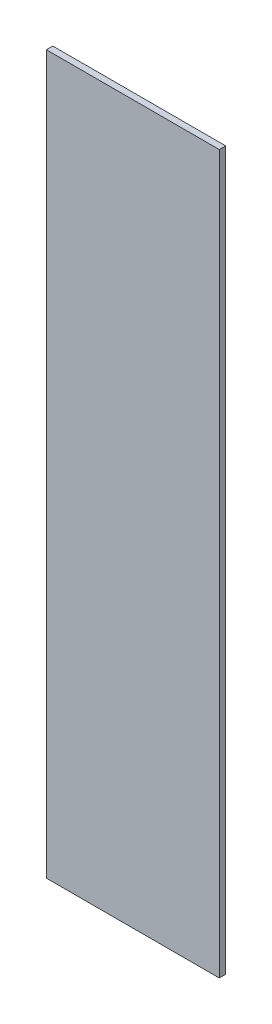
ISO-10303-21;
HEADER;
FILE_DESCRIPTION(('STEP AP214'),'2;1');
FILE_NAME('part.step','',(''),(''),'','','');
FILE_SCHEMA(('AUTOMOTIVE_DESIGN { 1 0 10303 214 1 1 1 1 }'));
ENDSEC;
DATA;
#1=APPLICATION_CONTEXT('core data for automotive mechanical design processes');
#2=APPLICATION_PROTOCOL_DEFINITION('international standard','automotive_design',2000,#1);
#3=PRODUCT_CONTEXT('',#1,'mechanical');
#4=PRODUCT('Part','Part','',(#3));
#5=PRODUCT_RELATED_PRODUCT_CATEGORY('part','',(#4));
#6=PRODUCT_DEFINITION_FORMATION('','',#4);
#7=PRODUCT_DEFINITION_CONTEXT('part definition',#1,'design');
#8=PRODUCT_DEFINITION('design','',#6,#7);
#9=PRODUCT_DEFINITION_SHAPE('','',#8);
#10=(LENGTH_UNIT() NAMED_UNIT(*) SI_UNIT(.MILLI.,.METRE.));
#11=(NAMED_UNIT(*) PLANE_ANGLE_UNIT() SI_UNIT($,.RADIAN.));
#12=(NAMED_UNIT(*) SI_UNIT($,.STERADIAN.) SOLID_ANGLE_UNIT());
#13=UNCERTAINTY_MEASURE_WITH_UNIT(LENGTH_MEASURE(1.E-05),#10,'distance_accuracy_value','');
#14=(GEOMETRIC_REPRESENTATION_CONTEXT(3) GLOBAL_UNCERTAINTY_ASSIGNED_CONTEXT((#13)) GLOBAL_UNIT_ASSIGNED_CONTEXT((#10,
#11,#12)) REPRESENTATION_CONTEXT('',''));
#15=CARTESIAN_POINT('',(0.,0.,0.));
#16=DIRECTION('',(0.,0.,1.));
#17=DIRECTION('',(1.,0.,0.));
#18=AXIS2_PLACEMENT_3D('',#15,#16,#17);
#19=CARTESIAN_POINT('',(171.45,-711.2,12.7));
#20=DIRECTION('',(-1.,0.,0.));
#21=DIRECTION('',(0.,0.,1.));
#22=AXIS2_PLACEMENT_3D('',#19,#20,#21);
#23=PLANE('',#22);
#24=DIRECTION('',(0.,1.,0.));
#25=VECTOR('',#24,1.);
#26=CARTESIAN_POINT('',(171.45,-711.2,0.));
#27=LINE('',#26,#25);
#28=CARTESIAN_POINT('',(171.45,-711.2,0.));
#29=VERTEX_POINT('',#28);
#30=CARTESIAN_POINT('',(171.45,711.2,0.));
#31=VERTEX_POINT('',#30);
#32=EDGE_CURVE('E96',#29,#31,#27,.T.);
#33=ORIENTED_EDGE('',*,*,#32,.T.);
#34=DIRECTION('',(0.,0.,-1.));
#35=VECTOR('',#34,1.);
#36=CARTESIAN_POINT('',(171.45,711.2,12.7));
#37=LINE('',#36,#35);
#38=CARTESIAN_POINT('',(171.45,711.2,12.7));
#39=VERTEX_POINT('',#38);
#40=EDGE_CURVE('E11',#39,#31,#37,.T.);
#41=ORIENTED_EDGE('',*,*,#40,.F.);
#42=DIRECTION('',(0.,1.,0.));
#43=VECTOR('',#42,1.);
#44=CARTESIAN_POINT('',(171.45,-711.2,12.7));
#45=LINE('',#44,#43);
#46=CARTESIAN_POINT('',(171.45,-711.2,12.7));
#47=VERTEX_POINT('',#46);
#48=EDGE_CURVE('E84',#47,#39,#45,.T.);
#49=ORIENTED_EDGE('',*,*,#48,.F.);
#50=DIRECTION('',(0.,0.,-1.));
#51=VECTOR('',#50,1.);
#52=CARTESIAN_POINT('',(171.45,-711.2,12.7));
#53=LINE('',#52,#51);
#54=EDGE_CURVE('E92',#47,#29,#53,.T.);
#55=ORIENTED_EDGE('',*,*,#54,.T.);
#56=EDGE_LOOP('',(#33,#41,#49,#55));
#57=FACE_BOUND('',#56,.T.);
#58=ADVANCED_FACE('F33',(#57),#23,.F.);
#59=CARTESIAN_POINT('',(-171.45,711.2,12.7));
#60=DIRECTION('',(0.,-1.,0.));
#61=DIRECTION('',(0.,0.,-1.));
#62=AXIS2_PLACEMENT_3D('',#59,#60,#61);
#63=PLANE('',#62);
#64=DIRECTION('',(-1.,0.,0.));
#65=VECTOR('',#64,1.);
#66=CARTESIAN_POINT('',(-171.45,711.2,0.));
#67=LINE('',#66,#65);
#68=CARTESIAN_POINT('',(-171.45,711.2,0.));
#69=VERTEX_POINT('',#68);
#70=EDGE_CURVE('E88',#31,#69,#67,.T.);
#71=ORIENTED_EDGE('',*,*,#70,.T.);
#72=DIRECTION('',(0.,0.,-1.));
#73=VECTOR('',#72,1.);
#74=CARTESIAN_POINT('',(-171.45,711.2,12.7));
#75=LINE('',#74,#73);
#76=CARTESIAN_POINT('',(-171.45,711.2,12.7));
#77=VERTEX_POINT('',#76);
#78=EDGE_CURVE('E41',#77,#69,#75,.T.);
#79=ORIENTED_EDGE('',*,*,#78,.F.);
#80=DIRECTION('',(-1.,0.,0.));
#81=VECTOR('',#80,1.);
#82=CARTESIAN_POINT('',(-171.45,711.2,12.7));
#83=LINE('',#82,#81);
#84=EDGE_CURVE('E79',#39,#77,#83,.T.);
#85=ORIENTED_EDGE('',*,*,#84,.F.);
#86=ORIENTED_EDGE('',*,*,#40,.T.);
#87=EDGE_LOOP('',(#71,#79,#85,#86));
#88=FACE_BOUND('',#87,.T.);
#89=ADVANCED_FACE('F87',(#88),#63,.F.);
#90=CARTESIAN_POINT('',(-171.45,-711.2,12.7));
#91=DIRECTION('',(1.,0.,0.));
#92=DIRECTION('',(0.,0.,-1.));
#93=AXIS2_PLACEMENT_3D('',#90,#91,#92);
#94=PLANE('',#93);
#95=DIRECTION('',(0.,-1.,0.));
#96=VECTOR('',#95,1.);
#97=CARTESIAN_POINT('',(-171.45,-711.2,0.));
#98=LINE('',#97,#96);
#99=CARTESIAN_POINT('',(-171.45,-711.2,0.));
#100=VERTEX_POINT('',#99);
#101=EDGE_CURVE('E66',#69,#100,#98,.T.);
#102=ORIENTED_EDGE('',*,*,#101,.T.);
#103=DIRECTION('',(0.,0.,-1.));
#104=VECTOR('',#103,1.);
#105=CARTESIAN_POINT('',(-171.45,-711.2,12.7));
#106=LINE('',#105,#104);
#107=CARTESIAN_POINT('',(-171.45,-711.2,12.7));
#108=VERTEX_POINT('',#107);
#109=EDGE_CURVE('E89',#108,#100,#106,.T.);
#110=ORIENTED_EDGE('',*,*,#109,.F.);
#111=DIRECTION('',(0.,-1.,0.));
#112=VECTOR('',#111,1.);
#113=CARTESIAN_POINT('',(-171.45,-711.2,12.7));
#114=LINE('',#113,#112);
#115=EDGE_CURVE('E82',#77,#108,#114,.T.);
#116=ORIENTED_EDGE('',*,*,#115,.F.);
#117=ORIENTED_EDGE('',*,*,#78,.T.);
#118=EDGE_LOOP('',(#102,#110,#116,#117));
#119=FACE_BOUND('',#118,.T.);
#120=ADVANCED_FACE('F90',(#119),#94,.F.);
#121=CARTESIAN_POINT('',(-171.45,-711.2,12.7));
#122=DIRECTION('',(0.,1.,0.));
#123=DIRECTION('',(0.,0.,1.));
#124=AXIS2_PLACEMENT_3D('',#121,#122,#123);
#125=PLANE('',#124);
#126=DIRECTION('',(1.,0.,0.));
#127=VECTOR('',#126,1.);
#128=CARTESIAN_POINT('',(-171.45,-711.2,0.));
#129=LINE('',#128,#127);
#130=EDGE_CURVE('E72',#100,#29,#129,.T.);
#131=ORIENTED_EDGE('',*,*,#130,.T.);
#132=ORIENTED_EDGE('',*,*,#54,.F.);
#133=DIRECTION('',(1.,0.,0.));
#134=VECTOR('',#133,1.);
#135=CARTESIAN_POINT('',(-171.45,-711.2,12.7));
#136=LINE('',#135,#134);
#137=EDGE_CURVE('E49',#108,#47,#136,.T.);
#138=ORIENTED_EDGE('',*,*,#137,.F.);
#139=ORIENTED_EDGE('',*,*,#109,.T.);
#140=EDGE_LOOP('',(#131,#132,#138,#139));
#141=FACE_BOUND('',#140,.T.);
#142=ADVANCED_FACE('F103',(#141),#125,.F.);
#143=CARTESIAN_POINT('',(0.,0.,12.7));
#144=DIRECTION('',(0.,0.,-1.));
#145=DIRECTION('',(-1.,0.,0.));
#146=AXIS2_PLACEMENT_3D('',#143,#144,#145);
#147=PLANE('',#146);
#148=ORIENTED_EDGE('',*,*,#48,.T.);
#149=ORIENTED_EDGE('',*,*,#84,.T.);
#150=ORIENTED_EDGE('',*,*,#115,.T.);
#151=ORIENTED_EDGE('',*,*,#137,.T.);
#152=EDGE_LOOP('',(#148,#149,#150,#151));
#153=FACE_BOUND('',#152,.T.);
#154=ADVANCED_FACE('F80',(#153),#147,.F.);
#155=CARTESIAN_POINT('',(0.,0.,0.));
#156=DIRECTION('',(0.,0.,-1.));
#157=DIRECTION('',(-1.,0.,0.));
#158=AXIS2_PLACEMENT_3D('',#155,#156,#157);
#159=PLANE('',#158);
#160=ORIENTED_EDGE('',*,*,#32,.F.);
#161=ORIENTED_EDGE('',*,*,#130,.F.);
#162=ORIENTED_EDGE('',*,*,#101,.F.);
#163=ORIENTED_EDGE('',*,*,#70,.F.);
#164=EDGE_LOOP('',(#160,#161,#162,#163));
#165=FACE_BOUND('',#164,.T.);
#166=ADVANCED_FACE('F106',(#165),#159,.T.);
#167=CLOSED_SHELL('',(#58,#89,#120,#142,#154,#166));
#168=MANIFOLD_SOLID_BREP('B2',#167);
#169=ADVANCED_BREP_SHAPE_REPRESENTATION('',(#18,#168),#14);
#170=SHAPE_DEFINITION_REPRESENTATION(#9,#169);
ENDSEC;
END-ISO-10303-21;
